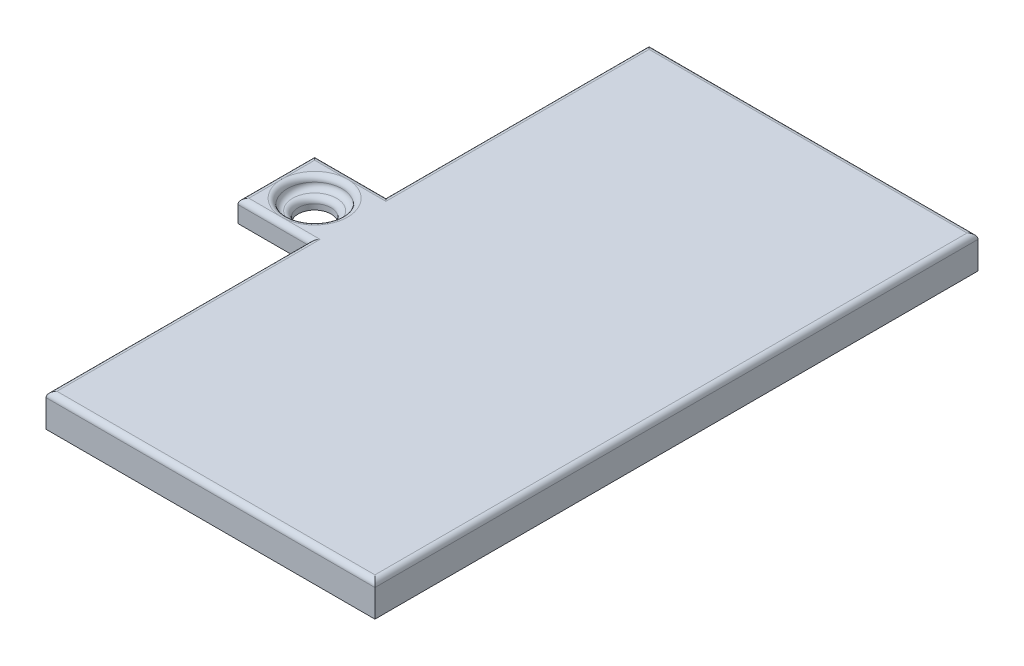
ISO-10303-21;
HEADER;
FILE_DESCRIPTION(('STEP AP214'),'2;1');
FILE_NAME('part.step','',(''),(''),'','','');
FILE_SCHEMA(('AUTOMOTIVE_DESIGN { 1 0 10303 214 1 1 1 1 }'));
ENDSEC;
DATA;
#1=APPLICATION_CONTEXT('core data for automotive mechanical design processes');
#2=APPLICATION_PROTOCOL_DEFINITION('international standard','automotive_design',2000,#1);
#3=PRODUCT_CONTEXT('',#1,'mechanical');
#4=PRODUCT('Part','Part','',(#3));
#5=PRODUCT_RELATED_PRODUCT_CATEGORY('part','',(#4));
#6=PRODUCT_DEFINITION_FORMATION('','',#4);
#7=PRODUCT_DEFINITION_CONTEXT('part definition',#1,'design');
#8=PRODUCT_DEFINITION('design','',#6,#7);
#9=PRODUCT_DEFINITION_SHAPE('','',#8);
#10=(LENGTH_UNIT() NAMED_UNIT(*) SI_UNIT(.MILLI.,.METRE.));
#11=(NAMED_UNIT(*) PLANE_ANGLE_UNIT() SI_UNIT($,.RADIAN.));
#12=(NAMED_UNIT(*) SI_UNIT($,.STERADIAN.) SOLID_ANGLE_UNIT());
#13=UNCERTAINTY_MEASURE_WITH_UNIT(LENGTH_MEASURE(1.E-05),#10,'distance_accuracy_value','');
#14=(GEOMETRIC_REPRESENTATION_CONTEXT(3) GLOBAL_UNCERTAINTY_ASSIGNED_CONTEXT((#13)) GLOBAL_UNIT_ASSIGNED_CONTEXT((#10,
#11,#12)) REPRESENTATION_CONTEXT('',''));
#15=CARTESIAN_POINT('',(0.,0.,0.));
#16=DIRECTION('',(0.,0.,1.));
#17=DIRECTION('',(1.,0.,0.));
#18=AXIS2_PLACEMENT_3D('',#15,#16,#17);
#19=CARTESIAN_POINT('',(0.,3.,0.));
#20=DIRECTION('',(0.,1.,0.));
#21=DIRECTION('',(0.,0.,1.));
#22=AXIS2_PLACEMENT_3D('',#19,#20,#21);
#23=PLANE('',#22);
#24=DIRECTION('',(-1.,0.,0.));
#25=VECTOR('',#24,1.);
#26=CARTESIAN_POINT('',(0.,3.,-2.99999999999999));
#27=LINE('',#26,#25);
#28=CARTESIAN_POINT('',(-18.,3.,-2.99999999999999));
#29=VERTEX_POINT('',#28);
#30=CARTESIAN_POINT('',(-21.,3.,-2.99999999999999));
#31=VERTEX_POINT('',#30);
#32=EDGE_CURVE('E249',#29,#31,#27,.T.);
#33=ORIENTED_EDGE('',*,*,#32,.T.);
#34=DIRECTION('',(0.,0.,1.));
#35=VECTOR('',#34,1.);
#36=CARTESIAN_POINT('',(-21.,3.,0.));
#37=LINE('',#36,#35);
#38=CARTESIAN_POINT('',(-21.,3.,0.));
#39=VERTEX_POINT('',#38);
#40=EDGE_CURVE('E252',#31,#39,#37,.T.);
#41=ORIENTED_EDGE('',*,*,#40,.T.);
#42=CARTESIAN_POINT('',(-18.,3.,0.));
#43=DIRECTION('',(0.,1.,0.));
#44=DIRECTION('',(0.,0.,1.));
#45=AXIS2_PLACEMENT_3D('',#42,#43,#44);
#46=CIRCLE('',#45,3.);
#47=EDGE_CURVE('E213',#39,#29,#46,.F.);
#48=ORIENTED_EDGE('',*,*,#47,.T.);
#49=EDGE_LOOP('',(#33,#41,#48));
#50=FACE_BOUND('',#49,.T.);
#51=ADVANCED_FACE('F38',(#50),#23,.T.);
#52=DIRECTION('',(0.,0.,1.));
#53=VECTOR('',#52,1.);
#54=CARTESIAN_POINT('',(-14.5,3.,-3.49999999999999));
#55=LINE('',#54,#53);
#56=CARTESIAN_POINT('',(-14.5,3.,-27.));
#57=VERTEX_POINT('',#56);
#58=CARTESIAN_POINT('',(-14.5,3.,-2.99999999999999));
#59=VERTEX_POINT('',#58);
#60=EDGE_CURVE('E243',#57,#59,#55,.T.);
#61=ORIENTED_EDGE('',*,*,#60,.T.);
#62=DIRECTION('',(-1.,0.,0.));
#63=VECTOR('',#62,1.);
#64=CARTESIAN_POINT('',(0.,3.,-2.99999999999999));
#65=LINE('',#64,#63);
#66=EDGE_CURVE('E246',#59,#29,#65,.T.);
#67=ORIENTED_EDGE('',*,*,#66,.T.);
#68=CARTESIAN_POINT('',(-18.,3.,0.));
#69=DIRECTION('',(0.,1.,0.));
#70=DIRECTION('',(0.,0.,1.));
#71=AXIS2_PLACEMENT_3D('',#68,#69,#70);
#72=CIRCLE('',#71,3.);
#73=CARTESIAN_POINT('',(-18.,3.,3.00000000000001));
#74=VERTEX_POINT('',#73);
#75=EDGE_CURVE('E209',#29,#74,#72,.F.);
#76=ORIENTED_EDGE('',*,*,#75,.T.);
#77=DIRECTION('',(1.,0.,0.));
#78=VECTOR('',#77,1.);
#79=CARTESIAN_POINT('',(0.,3.,3.));
#80=LINE('',#79,#78);
#81=CARTESIAN_POINT('',(-14.5,3.,3.00000000000001));
#82=VERTEX_POINT('',#81);
#83=EDGE_CURVE('E224',#74,#82,#80,.T.);
#84=ORIENTED_EDGE('',*,*,#83,.T.);
#85=DIRECTION('',(0.,0.,1.));
#86=VECTOR('',#85,1.);
#87=CARTESIAN_POINT('',(-14.5,3.,27.5));
#88=LINE('',#87,#86);
#89=CARTESIAN_POINT('',(-14.5,3.,27.));
#90=VERTEX_POINT('',#89);
#91=EDGE_CURVE('E230',#82,#90,#88,.T.);
#92=ORIENTED_EDGE('',*,*,#91,.T.);
#93=DIRECTION('',(1.,0.,0.));
#94=VECTOR('',#93,1.);
#95=CARTESIAN_POINT('',(15.,3.,27.));
#96=LINE('',#95,#94);
#97=CARTESIAN_POINT('',(14.5,3.,27.));
#98=VERTEX_POINT('',#97);
#99=EDGE_CURVE('E233',#90,#98,#96,.T.);
#100=ORIENTED_EDGE('',*,*,#99,.T.);
#101=DIRECTION('',(0.,0.,-1.));
#102=VECTOR('',#101,1.);
#103=CARTESIAN_POINT('',(14.5,3.,-27.5));
#104=LINE('',#103,#102);
#105=CARTESIAN_POINT('',(14.5,3.,-27.));
#106=VERTEX_POINT('',#105);
#107=EDGE_CURVE('E236',#98,#106,#104,.T.);
#108=ORIENTED_EDGE('',*,*,#107,.T.);
#109=DIRECTION('',(-1.,0.,0.));
#110=VECTOR('',#109,1.);
#111=CARTESIAN_POINT('',(-15.,3.,-27.));
#112=LINE('',#111,#110);
#113=EDGE_CURVE('E239',#106,#57,#112,.T.);
#114=ORIENTED_EDGE('',*,*,#113,.T.);
#115=EDGE_LOOP('',(#61,#67,#76,#84,#92,#100,#108,#114));
#116=FACE_BOUND('',#115,.T.);
#117=ADVANCED_FACE('F350',(#116),#23,.T.);
#118=CARTESIAN_POINT('',(-18.,1.,0.));
#119=DIRECTION('',(0.,1.,0.));
#120=DIRECTION('',(0.,0.,1.));
#121=AXIS2_PLACEMENT_3D('',#118,#119,#120);
#122=CYLINDRICAL_SURFACE('',#121,1.5);
#123=CARTESIAN_POINT('',(-18.,1.5,0.));
#124=DIRECTION('',(0.,1.,0.));
#125=DIRECTION('',(0.,0.,1.));
#126=AXIS2_PLACEMENT_3D('',#123,#124,#125);
#127=CIRCLE('',#126,1.5);
#128=CARTESIAN_POINT('',(-18.,1.5,1.5));
#129=VERTEX_POINT('',#128);
#130=EDGE_CURVE('E205',#129,#129,#127,.T.);
#131=ORIENTED_EDGE('',*,*,#130,.T.);
#132=EDGE_LOOP('',(#131));
#133=FACE_BOUND('',#132,.T.);
#134=CARTESIAN_POINT('',(-18.,1.,0.));
#135=DIRECTION('',(0.,1.,0.));
#136=DIRECTION('',(0.,0.,1.));
#137=AXIS2_PLACEMENT_3D('',#134,#135,#136);
#138=CIRCLE('',#137,1.5);
#139=CARTESIAN_POINT('',(-18.,1.,1.5));
#140=VERTEX_POINT('',#139);
#141=EDGE_CURVE('E150',#140,#140,#138,.T.);
#142=ORIENTED_EDGE('',*,*,#141,.F.);
#143=EDGE_LOOP('',(#142));
#144=FACE_BOUND('',#143,.T.);
#145=ADVANCED_FACE('F358',(#133,#144),#122,.F.);
#146=CARTESIAN_POINT('',(-15.,3.,27.5));
#147=DIRECTION('',(1.,0.,0.));
#148=DIRECTION('',(0.,0.,-1.));
#149=AXIS2_PLACEMENT_3D('',#146,#147,#148);
#150=PLANE('',#149);
#151=DIRECTION('',(0.,-1.,0.));
#152=VECTOR('',#151,1.);
#153=CARTESIAN_POINT('',(-15.,3.,27.5));
#154=LINE('',#153,#152);
#155=CARTESIAN_POINT('',(-15.,2.5,27.5));
#156=VERTEX_POINT('',#155);
#157=CARTESIAN_POINT('',(-15.,0.,27.5));
#158=VERTEX_POINT('',#157);
#159=EDGE_CURVE('E199',#156,#158,#154,.T.);
#160=ORIENTED_EDGE('',*,*,#159,.F.);
#161=DIRECTION('',(0.,0.,1.));
#162=VECTOR('',#161,1.);
#163=CARTESIAN_POINT('',(-15.,2.5,3.50000000000001));
#164=LINE('',#163,#162);
#165=CARTESIAN_POINT('',(-15.,2.5,3.50000000000001));
#166=VERTEX_POINT('',#165);
#167=EDGE_CURVE('E269',#156,#166,#164,.F.);
#168=ORIENTED_EDGE('',*,*,#167,.T.);
#169=DIRECTION('',(0.,-1.,0.));
#170=VECTOR('',#169,1.);
#171=CARTESIAN_POINT('',(-15.,3.,3.50000000000001));
#172=LINE('',#171,#170);
#173=CARTESIAN_POINT('',(-15.,1.,3.50000000000001));
#174=VERTEX_POINT('',#173);
#175=EDGE_CURVE('E171',#166,#174,#172,.T.);
#176=ORIENTED_EDGE('',*,*,#175,.T.);
#177=DIRECTION('',(0.,0.,-1.));
#178=VECTOR('',#177,1.);
#179=CARTESIAN_POINT('',(-15.,1.,27.5));
#180=LINE('',#179,#178);
#181=CARTESIAN_POINT('',(-15.,1.,-3.49999999999999));
#182=VERTEX_POINT('',#181);
#183=EDGE_CURVE('E202',#174,#182,#180,.T.);
#184=ORIENTED_EDGE('',*,*,#183,.T.);
#185=DIRECTION('',(0.,1.,0.));
#186=VECTOR('',#185,1.);
#187=CARTESIAN_POINT('',(-15.,3.,-3.49999999999999));
#188=LINE('',#187,#186);
#189=CARTESIAN_POINT('',(-15.,2.5,-3.49999999999999));
#190=VERTEX_POINT('',#189);
#191=EDGE_CURVE('E143',#182,#190,#188,.T.);
#192=ORIENTED_EDGE('',*,*,#191,.T.);
#193=DIRECTION('',(0.,0.,1.));
#194=VECTOR('',#193,1.);
#195=CARTESIAN_POINT('',(-15.,2.5,-27.5));
#196=LINE('',#195,#194);
#197=CARTESIAN_POINT('',(-15.,2.5,-27.5));
#198=VERTEX_POINT('',#197);
#199=EDGE_CURVE('E266',#190,#198,#196,.F.);
#200=ORIENTED_EDGE('',*,*,#199,.T.);
#201=DIRECTION('',(0.,-1.,0.));
#202=VECTOR('',#201,1.);
#203=CARTESIAN_POINT('',(-15.,3.,-27.5));
#204=LINE('',#203,#202);
#205=CARTESIAN_POINT('',(-15.,0.,-27.5));
#206=VERTEX_POINT('',#205);
#207=EDGE_CURVE('E190',#198,#206,#204,.T.);
#208=ORIENTED_EDGE('',*,*,#207,.T.);
#209=DIRECTION('',(0.,0.,1.));
#210=VECTOR('',#209,1.);
#211=CARTESIAN_POINT('',(-15.,0.,27.5));
#212=LINE('',#211,#210);
#213=EDGE_CURVE('E174',#206,#158,#212,.T.);
#214=ORIENTED_EDGE('',*,*,#213,.T.);
#215=EDGE_LOOP('',(#160,#168,#176,#184,#192,#200,#208,#214));
#216=FACE_BOUND('',#215,.T.);
#217=ADVANCED_FACE('F334',(#216),#150,.F.);
#218=CARTESIAN_POINT('',(15.,3.,27.5));
#219=DIRECTION('',(0.,0.,-1.));
#220=DIRECTION('',(-1.,0.,0.));
#221=AXIS2_PLACEMENT_3D('',#218,#219,#220);
#222=PLANE('',#221);
#223=DIRECTION('',(0.,-1.,0.));
#224=VECTOR('',#223,1.);
#225=CARTESIAN_POINT('',(15.,3.,27.5));
#226=LINE('',#225,#224);
#227=CARTESIAN_POINT('',(15.,2.5,27.5));
#228=VERTEX_POINT('',#227);
#229=CARTESIAN_POINT('',(15.,0.,27.5));
#230=VERTEX_POINT('',#229);
#231=EDGE_CURVE('E196',#228,#230,#226,.T.);
#232=ORIENTED_EDGE('',*,*,#231,.F.);
#233=DIRECTION('',(1.,0.,0.));
#234=VECTOR('',#233,1.);
#235=CARTESIAN_POINT('',(-15.,2.5,27.5));
#236=LINE('',#235,#234);
#237=EDGE_CURVE('E263',#228,#156,#236,.F.);
#238=ORIENTED_EDGE('',*,*,#237,.T.);
#239=ORIENTED_EDGE('',*,*,#159,.T.);
#240=DIRECTION('',(1.,0.,0.));
#241=VECTOR('',#240,1.);
#242=CARTESIAN_POINT('',(15.,0.,27.5));
#243=LINE('',#242,#241);
#244=EDGE_CURVE('E178',#158,#230,#243,.T.);
#245=ORIENTED_EDGE('',*,*,#244,.T.);
#246=EDGE_LOOP('',(#232,#238,#239,#245));
#247=FACE_BOUND('',#246,.T.);
#248=ADVANCED_FACE('F393',(#247),#222,.F.);
#249=CARTESIAN_POINT('',(15.,3.,27.5));
#250=DIRECTION('',(-1.,0.,0.));
#251=DIRECTION('',(0.,0.,1.));
#252=AXIS2_PLACEMENT_3D('',#249,#250,#251);
#253=PLANE('',#252);
#254=DIRECTION('',(0.,-1.,0.));
#255=VECTOR('',#254,1.);
#256=CARTESIAN_POINT('',(15.,3.,-27.5));
#257=LINE('',#256,#255);
#258=CARTESIAN_POINT('',(15.,2.5,-27.5));
#259=VERTEX_POINT('',#258);
#260=CARTESIAN_POINT('',(15.,0.,-27.5));
#261=VERTEX_POINT('',#260);
#262=EDGE_CURVE('E193',#259,#261,#257,.T.);
#263=ORIENTED_EDGE('',*,*,#262,.F.);
#264=DIRECTION('',(0.,0.,-1.));
#265=VECTOR('',#264,1.);
#266=CARTESIAN_POINT('',(15.,2.5,27.5));
#267=LINE('',#266,#265);
#268=EDGE_CURVE('E260',#259,#228,#267,.F.);
#269=ORIENTED_EDGE('',*,*,#268,.T.);
#270=ORIENTED_EDGE('',*,*,#231,.T.);
#271=DIRECTION('',(0.,0.,-1.));
#272=VECTOR('',#271,1.);
#273=CARTESIAN_POINT('',(15.,0.,27.5));
#274=LINE('',#273,#272);
#275=EDGE_CURVE('E182',#230,#261,#274,.T.);
#276=ORIENTED_EDGE('',*,*,#275,.T.);
#277=EDGE_LOOP('',(#263,#269,#270,#276));
#278=FACE_BOUND('',#277,.T.);
#279=ADVANCED_FACE('F368',(#278),#253,.F.);
#280=CARTESIAN_POINT('',(15.,3.,-27.5));
#281=DIRECTION('',(0.,0.,1.));
#282=DIRECTION('',(1.,0.,0.));
#283=AXIS2_PLACEMENT_3D('',#280,#281,#282);
#284=PLANE('',#283);
#285=ORIENTED_EDGE('',*,*,#207,.F.);
#286=DIRECTION('',(-1.,0.,0.));
#287=VECTOR('',#286,1.);
#288=CARTESIAN_POINT('',(15.,2.5,-27.5));
#289=LINE('',#288,#287);
#290=EDGE_CURVE('E256',#198,#259,#289,.F.);
#291=ORIENTED_EDGE('',*,*,#290,.T.);
#292=ORIENTED_EDGE('',*,*,#262,.T.);
#293=DIRECTION('',(-1.,0.,0.));
#294=VECTOR('',#293,1.);
#295=CARTESIAN_POINT('',(15.,0.,-27.5));
#296=LINE('',#295,#294);
#297=EDGE_CURVE('E186',#261,#206,#296,.T.);
#298=ORIENTED_EDGE('',*,*,#297,.T.);
#299=EDGE_LOOP('',(#285,#291,#292,#298));
#300=FACE_BOUND('',#299,.T.);
#301=ADVANCED_FACE('F361',(#300),#284,.F.);
#302=DIRECTION('',(0.,0.,1.));
#303=VECTOR('',#302,1.);
#304=CARTESIAN_POINT('',(-21.,3.,0.));
#305=LINE('',#304,#303);
#306=CARTESIAN_POINT('',(-21.,3.,3.00000000000001));
#307=VERTEX_POINT('',#306);
#308=EDGE_CURVE('E221',#39,#307,#305,.T.);
#309=ORIENTED_EDGE('',*,*,#308,.T.);
#310=DIRECTION('',(1.,0.,0.));
#311=VECTOR('',#310,1.);
#312=CARTESIAN_POINT('',(0.,3.,3.));
#313=LINE('',#312,#311);
#314=EDGE_CURVE('E227',#307,#74,#313,.T.);
#315=ORIENTED_EDGE('',*,*,#314,.T.);
#316=CARTESIAN_POINT('',(-18.,3.,0.));
#317=DIRECTION('',(0.,1.,0.));
#318=DIRECTION('',(0.,0.,1.));
#319=AXIS2_PLACEMENT_3D('',#316,#317,#318);
#320=CIRCLE('',#319,3.);
#321=EDGE_CURVE('E217',#74,#39,#320,.F.);
#322=ORIENTED_EDGE('',*,*,#321,.T.);
#323=EDGE_LOOP('',(#309,#315,#322));
#324=FACE_BOUND('',#323,.T.);
#325=ADVANCED_FACE('F353',(#324),#23,.T.);
#326=CARTESIAN_POINT('',(0.,0.,0.));
#327=DIRECTION('',(0.,1.,0.));
#328=DIRECTION('',(0.,0.,1.));
#329=AXIS2_PLACEMENT_3D('',#326,#327,#328);
#330=PLANE('',#329);
#331=ORIENTED_EDGE('',*,*,#213,.F.);
#332=ORIENTED_EDGE('',*,*,#297,.F.);
#333=ORIENTED_EDGE('',*,*,#275,.F.);
#334=ORIENTED_EDGE('',*,*,#244,.F.);
#335=EDGE_LOOP('',(#331,#332,#333,#334));
#336=FACE_BOUND('',#335,.T.);
#337=ADVANCED_FACE('F345',(#336),#330,.F.);
#338=CARTESIAN_POINT('',(0.,1.,0.));
#339=DIRECTION('',(0.,-1.,0.));
#340=DIRECTION('',(0.,0.,-1.));
#341=AXIS2_PLACEMENT_3D('',#338,#339,#340);
#342=PLANE('',#341);
#343=ORIENTED_EDGE('',*,*,#141,.T.);
#344=EDGE_LOOP('',(#343));
#345=FACE_BOUND('',#344,.T.);
#346=ORIENTED_EDGE('',*,*,#183,.F.);
#347=DIRECTION('',(1.,0.,0.));
#348=VECTOR('',#347,1.);
#349=CARTESIAN_POINT('',(-14.5,1.,3.50000000000001));
#350=LINE('',#349,#348);
#351=CARTESIAN_POINT('',(-21.5,1.,3.50000000000001));
#352=VERTEX_POINT('',#351);
#353=EDGE_CURVE('E157',#352,#174,#350,.T.);
#354=ORIENTED_EDGE('',*,*,#353,.F.);
#355=DIRECTION('',(0.,0.,1.));
#356=VECTOR('',#355,1.);
#357=CARTESIAN_POINT('',(-21.5,1.,-3.49999999999999));
#358=LINE('',#357,#356);
#359=CARTESIAN_POINT('',(-21.5,1.,-3.49999999999999));
#360=VERTEX_POINT('',#359);
#361=EDGE_CURVE('E149',#360,#352,#358,.T.);
#362=ORIENTED_EDGE('',*,*,#361,.F.);
#363=DIRECTION('',(-1.,0.,0.));
#364=VECTOR('',#363,1.);
#365=CARTESIAN_POINT('',(-14.5,1.,-3.49999999999999));
#366=LINE('',#365,#364);
#367=EDGE_CURVE('E138',#182,#360,#366,.T.);
#368=ORIENTED_EDGE('',*,*,#367,.F.);
#369=EDGE_LOOP('',(#346,#354,#362,#368));
#370=FACE_BOUND('',#369,.T.);
#371=ADVANCED_FACE('F159',(#345,#370),#342,.T.);
#372=CARTESIAN_POINT('',(-14.5,1.,3.50000000000001));
#373=DIRECTION('',(0.,0.,1.));
#374=DIRECTION('',(1.,0.,0.));
#375=AXIS2_PLACEMENT_3D('',#372,#373,#374);
#376=PLANE('',#375);
#377=ORIENTED_EDGE('',*,*,#175,.F.);
#378=DIRECTION('',(1.,0.,0.));
#379=VECTOR('',#378,1.);
#380=CARTESIAN_POINT('',(-14.5,2.5,3.50000000000001));
#381=LINE('',#380,#379);
#382=CARTESIAN_POINT('',(-21.5,2.5,3.50000000000001));
#383=VERTEX_POINT('',#382);
#384=EDGE_CURVE('E63',#166,#383,#381,.F.);
#385=ORIENTED_EDGE('',*,*,#384,.T.);
#386=DIRECTION('',(0.,1.,0.));
#387=VECTOR('',#386,1.);
#388=CARTESIAN_POINT('',(-21.5,1.,3.50000000000001));
#389=LINE('',#388,#387);
#390=EDGE_CURVE('E156',#352,#383,#389,.T.);
#391=ORIENTED_EDGE('',*,*,#390,.F.);
#392=ORIENTED_EDGE('',*,*,#353,.T.);
#393=EDGE_LOOP('',(#377,#385,#391,#392));
#394=FACE_BOUND('',#393,.T.);
#395=ADVANCED_FACE('F336',(#394),#376,.T.);
#396=CARTESIAN_POINT('',(-14.5,1.,-3.49999999999999));
#397=DIRECTION('',(0.,0.,-1.));
#398=DIRECTION('',(-1.,0.,0.));
#399=AXIS2_PLACEMENT_3D('',#396,#397,#398);
#400=PLANE('',#399);
#401=DIRECTION('',(0.,1.,0.));
#402=VECTOR('',#401,1.);
#403=CARTESIAN_POINT('',(-21.5,1.,-3.49999999999999));
#404=LINE('',#403,#402);
#405=CARTESIAN_POINT('',(-21.5,2.5,-3.49999999999999));
#406=VERTEX_POINT('',#405);
#407=EDGE_CURVE('E140',#360,#406,#404,.T.);
#408=ORIENTED_EDGE('',*,*,#407,.T.);
#409=DIRECTION('',(-1.,0.,0.));
#410=VECTOR('',#409,1.);
#411=CARTESIAN_POINT('',(-14.5,2.5,-3.49999999999999));
#412=LINE('',#411,#410);
#413=EDGE_CURVE('E11',#406,#190,#412,.F.);
#414=ORIENTED_EDGE('',*,*,#413,.T.);
#415=ORIENTED_EDGE('',*,*,#191,.F.);
#416=ORIENTED_EDGE('',*,*,#367,.T.);
#417=EDGE_LOOP('',(#408,#414,#415,#416));
#418=FACE_BOUND('',#417,.T.);
#419=ADVANCED_FACE('F139',(#418),#400,.T.);
#420=CARTESIAN_POINT('',(-21.5,1.,-3.49999999999999));
#421=DIRECTION('',(-1.,0.,0.));
#422=DIRECTION('',(0.,0.,1.));
#423=AXIS2_PLACEMENT_3D('',#420,#421,#422);
#424=PLANE('',#423);
#425=ORIENTED_EDGE('',*,*,#390,.T.);
#426=DIRECTION('',(0.,0.,1.));
#427=VECTOR('',#426,1.);
#428=CARTESIAN_POINT('',(-21.5,2.5,-3.49999999999999));
#429=LINE('',#428,#427);
#430=EDGE_CURVE('E48',#383,#406,#429,.F.);
#431=ORIENTED_EDGE('',*,*,#430,.T.);
#432=ORIENTED_EDGE('',*,*,#407,.F.);
#433=ORIENTED_EDGE('',*,*,#361,.T.);
#434=EDGE_LOOP('',(#425,#431,#432,#433));
#435=FACE_BOUND('',#434,.T.);
#436=ADVANCED_FACE('F153',(#435),#424,.T.);
#437=CARTESIAN_POINT('',(-18.,2.5,0.));
#438=DIRECTION('',(0.,1.,0.));
#439=DIRECTION('',(0.,0.,1.));
#440=AXIS2_PLACEMENT_3D('',#437,#438,#439);
#441=TOROIDAL_SURFACE('',#440,3.,0.5);
#442=ORIENTED_EDGE('',*,*,#47,.F.);
#443=ORIENTED_EDGE('',*,*,#321,.F.);
#444=ORIENTED_EDGE('',*,*,#75,.F.);
#445=EDGE_LOOP('',(#442,#443,#444));
#446=FACE_BOUND('',#445,.T.);
#447=CARTESIAN_POINT('',(-18.,2.5,0.));
#448=DIRECTION('',(0.,1.,0.));
#449=DIRECTION('',(0.,0.,1.));
#450=AXIS2_PLACEMENT_3D('',#447,#448,#449);
#451=CIRCLE('',#450,2.5);
#452=CARTESIAN_POINT('',(-18.,2.5,2.5));
#453=VERTEX_POINT('',#452);
#454=EDGE_CURVE('E280',#453,#453,#451,.T.);
#455=ORIENTED_EDGE('',*,*,#454,.F.);
#456=EDGE_LOOP('',(#455));
#457=FACE_BOUND('',#456,.T.);
#458=ADVANCED_FACE('F373',(#446,#457),#441,.T.);
#459=CARTESIAN_POINT('',(-18.,2.5,0.));
#460=DIRECTION('',(0.,1.,0.));
#461=DIRECTION('',(0.,0.,1.));
#462=AXIS2_PLACEMENT_3D('',#459,#460,#461);
#463=TOROIDAL_SURFACE('',#462,2.,0.5);
#464=ORIENTED_EDGE('',*,*,#454,.T.);
#465=EDGE_LOOP('',(#464));
#466=FACE_BOUND('',#465,.T.);
#467=CARTESIAN_POINT('',(-18.,2.,0.));
#468=DIRECTION('',(0.,1.,0.));
#469=DIRECTION('',(0.,0.,1.));
#470=AXIS2_PLACEMENT_3D('',#467,#468,#469);
#471=CIRCLE('',#470,2.);
#472=CARTESIAN_POINT('',(-18.,2.,2.));
#473=VERTEX_POINT('',#472);
#474=EDGE_CURVE('E276',#473,#473,#471,.T.);
#475=ORIENTED_EDGE('',*,*,#474,.F.);
#476=EDGE_LOOP('',(#475));
#477=FACE_BOUND('',#476,.T.);
#478=ADVANCED_FACE('F423',(#466,#477),#463,.F.);
#479=CARTESIAN_POINT('',(-18.,1.5,0.));
#480=DIRECTION('',(0.,1.,0.));
#481=DIRECTION('',(0.,0.,1.));
#482=AXIS2_PLACEMENT_3D('',#479,#480,#481);
#483=TOROIDAL_SURFACE('',#482,2.,0.5);
#484=ORIENTED_EDGE('',*,*,#130,.F.);
#485=EDGE_LOOP('',(#484));
#486=FACE_BOUND('',#485,.T.);
#487=ORIENTED_EDGE('',*,*,#474,.T.);
#488=EDGE_LOOP('',(#487));
#489=FACE_BOUND('',#488,.T.);
#490=ADVANCED_FACE('F419',(#486,#489),#483,.T.);
#491=CARTESIAN_POINT('',(0.,2.5,3.));
#492=DIRECTION('',(1.,0.,0.));
#493=DIRECTION('',(0.,0.,-1.));
#494=AXIS2_PLACEMENT_3D('',#491,#492,#493);
#495=CYLINDRICAL_SURFACE('',#494,0.5);
#496=CARTESIAN_POINT('',(-21.,2.5,3.00000000000001));
#497=DIRECTION('',(0.707106781186548,0.,0.707106781186547));
#498=DIRECTION('',(-0.707106781186547,0.,0.707106781186548));
#499=AXIS2_PLACEMENT_3D('',#496,#497,#498);
#500=ELLIPSE('',#499,0.707106781186547,0.5);
#501=EDGE_CURVE('E305',#383,#307,#500,.F.);
#502=ORIENTED_EDGE('',*,*,#501,.F.);
#503=ORIENTED_EDGE('',*,*,#384,.F.);
#504=CARTESIAN_POINT('',(-14.5,2.5,3.00000000000001));
#505=DIRECTION('',(-0.707106781186548,0.,-0.707106781186547));
#506=DIRECTION('',(0.707106781186547,0.,-0.707106781186548));
#507=AXIS2_PLACEMENT_3D('',#504,#505,#506);
#508=ELLIPSE('',#507,0.707106781186548,0.5);
#509=EDGE_CURVE('E42',#82,#166,#508,.F.);
#510=ORIENTED_EDGE('',*,*,#509,.F.);
#511=ORIENTED_EDGE('',*,*,#83,.F.);
#512=ORIENTED_EDGE('',*,*,#314,.F.);
#513=EDGE_LOOP('',(#502,#503,#510,#511,#512));
#514=FACE_BOUND('',#513,.T.);
#515=ADVANCED_FACE('F40',(#514),#495,.T.);
#516=CARTESIAN_POINT('',(-14.5,2.5,0.));
#517=DIRECTION('',(0.,0.,-1.));
#518=DIRECTION('',(-1.,0.,0.));
#519=AXIS2_PLACEMENT_3D('',#516,#517,#518);
#520=CYLINDRICAL_SURFACE('',#519,0.5);
#521=ORIENTED_EDGE('',*,*,#509,.T.);
#522=ORIENTED_EDGE('',*,*,#167,.F.);
#523=CARTESIAN_POINT('',(-14.5,2.5,27.));
#524=DIRECTION('',(-0.707106781186548,0.,-0.707106781186547));
#525=DIRECTION('',(0.707106781186547,0.,-0.707106781186548));
#526=AXIS2_PLACEMENT_3D('',#523,#524,#525);
#527=ELLIPSE('',#526,0.707106781186548,0.5);
#528=EDGE_CURVE('E302',#90,#156,#527,.F.);
#529=ORIENTED_EDGE('',*,*,#528,.F.);
#530=ORIENTED_EDGE('',*,*,#91,.F.);
#531=EDGE_LOOP('',(#521,#522,#529,#530));
#532=FACE_BOUND('',#531,.T.);
#533=ADVANCED_FACE('F317',(#532),#520,.T.);
#534=CARTESIAN_POINT('',(-21.,2.5,0.));
#535=DIRECTION('',(0.,0.,1.));
#536=DIRECTION('',(1.,0.,0.));
#537=AXIS2_PLACEMENT_3D('',#534,#535,#536);
#538=CYLINDRICAL_SURFACE('',#537,0.5);
#539=ORIENTED_EDGE('',*,*,#308,.F.);
#540=ORIENTED_EDGE('',*,*,#40,.F.);
#541=CARTESIAN_POINT('',(-21.,2.5,-2.99999999999999));
#542=DIRECTION('',(-0.707106781186547,0.,0.707106781186548));
#543=DIRECTION('',(-0.707106781186548,0.,-0.707106781186548));
#544=AXIS2_PLACEMENT_3D('',#541,#542,#543);
#545=ELLIPSE('',#544,0.707106781186548,0.5);
#546=EDGE_CURVE('E298',#406,#31,#545,.F.);
#547=ORIENTED_EDGE('',*,*,#546,.F.);
#548=ORIENTED_EDGE('',*,*,#430,.F.);
#549=ORIENTED_EDGE('',*,*,#501,.T.);
#550=EDGE_LOOP('',(#539,#540,#547,#548,#549));
#551=FACE_BOUND('',#550,.T.);
#552=ADVANCED_FACE('F323',(#551),#538,.T.);
#553=CARTESIAN_POINT('',(0.,2.5,27.));
#554=DIRECTION('',(-1.,0.,0.));
#555=DIRECTION('',(0.,0.,1.));
#556=AXIS2_PLACEMENT_3D('',#553,#554,#555);
#557=CYLINDRICAL_SURFACE('',#556,0.5);
#558=ORIENTED_EDGE('',*,*,#528,.T.);
#559=ORIENTED_EDGE('',*,*,#237,.F.);
#560=CARTESIAN_POINT('',(14.5,2.5,27.));
#561=DIRECTION('',(-0.707106781186547,0.,0.707106781186548));
#562=DIRECTION('',(-0.707106781186548,0.,-0.707106781186547));
#563=AXIS2_PLACEMENT_3D('',#560,#561,#562);
#564=ELLIPSE('',#563,0.707106781186547,0.5);
#565=EDGE_CURVE('E294',#98,#228,#564,.F.);
#566=ORIENTED_EDGE('',*,*,#565,.F.);
#567=ORIENTED_EDGE('',*,*,#99,.F.);
#568=EDGE_LOOP('',(#558,#559,#566,#567));
#569=FACE_BOUND('',#568,.T.);
#570=ADVANCED_FACE('F397',(#569),#557,.T.);
#571=CARTESIAN_POINT('',(0.,2.5,-2.99999999999999));
#572=DIRECTION('',(-1.,0.,0.));
#573=DIRECTION('',(0.,0.,1.));
#574=AXIS2_PLACEMENT_3D('',#571,#572,#573);
#575=CYLINDRICAL_SURFACE('',#574,0.5);
#576=ORIENTED_EDGE('',*,*,#32,.F.);
#577=ORIENTED_EDGE('',*,*,#66,.F.);
#578=CARTESIAN_POINT('',(-14.5,2.5,-2.99999999999999));
#579=DIRECTION('',(-0.707106781186548,0.,0.707106781186547));
#580=DIRECTION('',(-0.707106781186547,0.,-0.707106781186548));
#581=AXIS2_PLACEMENT_3D('',#578,#579,#580);
#582=ELLIPSE('',#581,0.707106781186548,0.5);
#583=EDGE_CURVE('E290',#190,#59,#582,.F.);
#584=ORIENTED_EDGE('',*,*,#583,.F.);
#585=ORIENTED_EDGE('',*,*,#413,.F.);
#586=ORIENTED_EDGE('',*,*,#546,.T.);
#587=EDGE_LOOP('',(#576,#577,#584,#585,#586));
#588=FACE_BOUND('',#587,.T.);
#589=ADVANCED_FACE('F329',(#588),#575,.T.);
#590=CARTESIAN_POINT('',(14.5,2.5,0.));
#591=DIRECTION('',(0.,0.,1.));
#592=DIRECTION('',(1.,0.,0.));
#593=AXIS2_PLACEMENT_3D('',#590,#591,#592);
#594=CYLINDRICAL_SURFACE('',#593,0.5);
#595=ORIENTED_EDGE('',*,*,#565,.T.);
#596=ORIENTED_EDGE('',*,*,#268,.F.);
#597=CARTESIAN_POINT('',(14.5,2.5,-27.));
#598=DIRECTION('',(0.707106781186548,0.,0.707106781186547));
#599=DIRECTION('',(-0.707106781186547,0.,0.707106781186548));
#600=AXIS2_PLACEMENT_3D('',#597,#598,#599);
#601=ELLIPSE('',#600,0.707106781186548,0.5);
#602=EDGE_CURVE('E287',#106,#259,#601,.F.);
#603=ORIENTED_EDGE('',*,*,#602,.F.);
#604=ORIENTED_EDGE('',*,*,#107,.F.);
#605=EDGE_LOOP('',(#595,#596,#603,#604));
#606=FACE_BOUND('',#605,.T.);
#607=ADVANCED_FACE('F401',(#606),#594,.T.);
#608=CARTESIAN_POINT('',(-14.5,2.5,0.));
#609=DIRECTION('',(0.,0.,-1.));
#610=DIRECTION('',(-1.,0.,0.));
#611=AXIS2_PLACEMENT_3D('',#608,#609,#610);
#612=CYLINDRICAL_SURFACE('',#611,0.5);
#613=ORIENTED_EDGE('',*,*,#583,.T.);
#614=ORIENTED_EDGE('',*,*,#60,.F.);
#615=CARTESIAN_POINT('',(-14.5,2.5,-27.));
#616=DIRECTION('',(0.707106781186547,0.,-0.707106781186548));
#617=DIRECTION('',(-0.707106781186548,0.,-0.707106781186547));
#618=AXIS2_PLACEMENT_3D('',#615,#616,#617);
#619=ELLIPSE('',#618,0.707106781186547,0.5);
#620=EDGE_CURVE('E284',#198,#57,#619,.T.);
#621=ORIENTED_EDGE('',*,*,#620,.F.);
#622=ORIENTED_EDGE('',*,*,#199,.F.);
#623=EDGE_LOOP('',(#613,#614,#621,#622));
#624=FACE_BOUND('',#623,.T.);
#625=ADVANCED_FACE('F377',(#624),#612,.T.);
#626=CARTESIAN_POINT('',(0.,2.5,-27.));
#627=DIRECTION('',(1.,0.,0.));
#628=DIRECTION('',(0.,0.,-1.));
#629=AXIS2_PLACEMENT_3D('',#626,#627,#628);
#630=CYLINDRICAL_SURFACE('',#629,0.5);
#631=ORIENTED_EDGE('',*,*,#602,.T.);
#632=ORIENTED_EDGE('',*,*,#290,.F.);
#633=ORIENTED_EDGE('',*,*,#620,.T.);
#634=ORIENTED_EDGE('',*,*,#113,.F.);
#635=EDGE_LOOP('',(#631,#632,#633,#634));
#636=FACE_BOUND('',#635,.T.);
#637=ADVANCED_FACE('F382',(#636),#630,.T.);
#638=CLOSED_SHELL('',(#51,#117,#145,#217,#248,#279,#301,#325,#337,#371,#395,#419,#436,#458,#478,
#490,#515,#533,#552,#570,#589,#607,#625,#637));
#639=MANIFOLD_SOLID_BREP('B2',#638);
#640=ADVANCED_BREP_SHAPE_REPRESENTATION('',(#18,#639),#14);
#641=SHAPE_DEFINITION_REPRESENTATION(#9,#640);
ENDSEC;
END-ISO-10303-21;
